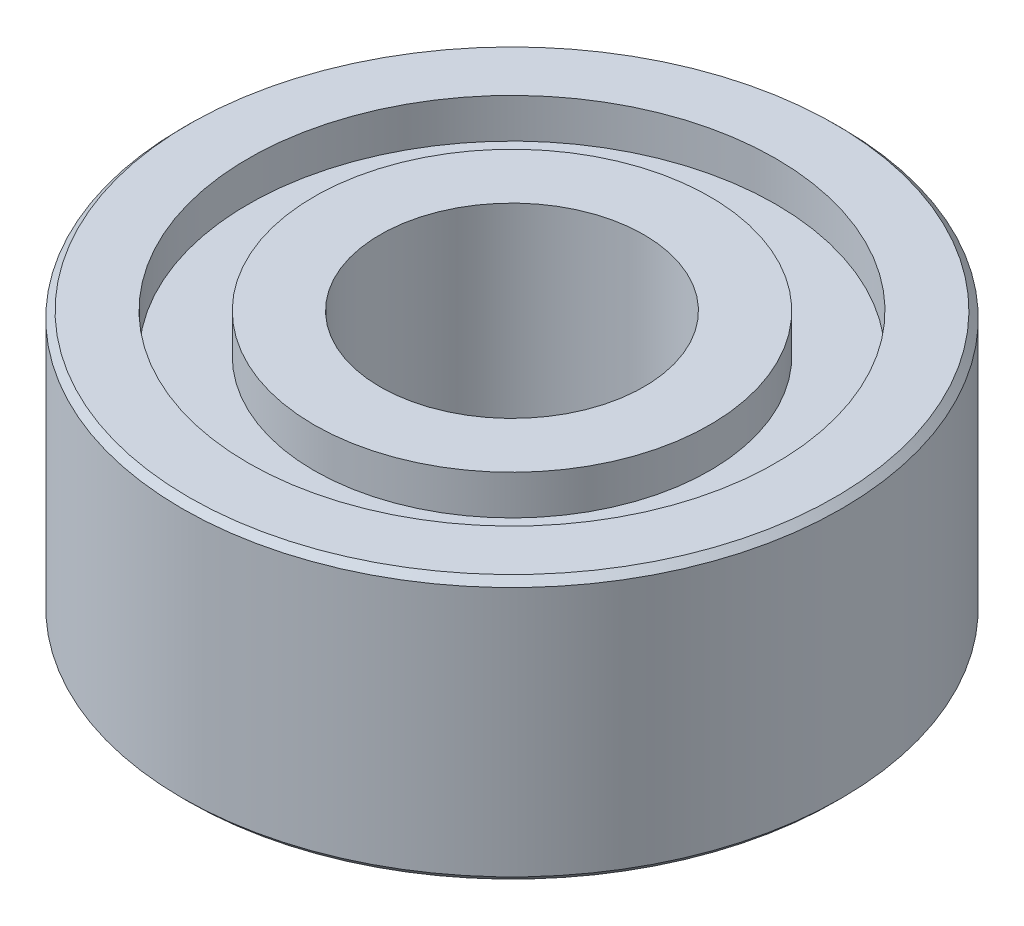
ISO-10303-21;
HEADER;
FILE_DESCRIPTION(('STEP AP214'),'2;1');
FILE_NAME('part.step','',(''),(''),'','','');
FILE_SCHEMA(('AUTOMOTIVE_DESIGN { 1 0 10303 214 1 1 1 1 }'));
ENDSEC;
DATA;
#1=APPLICATION_CONTEXT('core data for automotive mechanical design processes');
#2=APPLICATION_PROTOCOL_DEFINITION('international standard','automotive_design',2000,#1);
#3=PRODUCT_CONTEXT('',#1,'mechanical');
#4=PRODUCT('Part','Part','',(#3));
#5=PRODUCT_RELATED_PRODUCT_CATEGORY('part','',(#4));
#6=PRODUCT_DEFINITION_FORMATION('','',#4);
#7=PRODUCT_DEFINITION_CONTEXT('part definition',#1,'design');
#8=PRODUCT_DEFINITION('design','',#6,#7);
#9=PRODUCT_DEFINITION_SHAPE('','',#8);
#10=(LENGTH_UNIT() NAMED_UNIT(*) SI_UNIT(.MILLI.,.METRE.));
#11=(NAMED_UNIT(*) PLANE_ANGLE_UNIT() SI_UNIT($,.RADIAN.));
#12=(NAMED_UNIT(*) SI_UNIT($,.STERADIAN.) SOLID_ANGLE_UNIT());
#13=UNCERTAINTY_MEASURE_WITH_UNIT(LENGTH_MEASURE(1.E-05),#10,'distance_accuracy_value','');
#14=(GEOMETRIC_REPRESENTATION_CONTEXT(3) GLOBAL_UNCERTAINTY_ASSIGNED_CONTEXT((#13)) GLOBAL_UNIT_ASSIGNED_CONTEXT((#10,
#11,#12)) REPRESENTATION_CONTEXT('',''));
#15=CARTESIAN_POINT('',(0.,0.,0.));
#16=DIRECTION('',(0.,0.,1.));
#17=DIRECTION('',(1.,0.,0.));
#18=AXIS2_PLACEMENT_3D('',#15,#16,#17);
#19=CARTESIAN_POINT('',(0.,-2.,0.));
#20=DIRECTION('',(0.,1.,0.));
#21=DIRECTION('',(0.,0.,1.));
#22=AXIS2_PLACEMENT_3D('',#19,#20,#21);
#23=PLANE('',#22);
#24=CARTESIAN_POINT('',(0.,-2.,0.));
#25=DIRECTION('',(0.,1.,0.));
#26=DIRECTION('',(0.,0.,1.));
#27=AXIS2_PLACEMENT_3D('',#24,#25,#26);
#28=CIRCLE('',#27,2.);
#29=CARTESIAN_POINT('',(0.,-2.,2.));
#30=VERTEX_POINT('',#29);
#31=EDGE_CURVE('E54',#30,#30,#28,.T.);
#32=ORIENTED_EDGE('',*,*,#31,.T.);
#33=EDGE_LOOP('',(#32));
#34=FACE_BOUND('',#33,.T.);
#35=CARTESIAN_POINT('',(0.,-2.,0.));
#36=DIRECTION('',(0.,1.,0.));
#37=DIRECTION('',(0.,0.,1.));
#38=AXIS2_PLACEMENT_3D('',#35,#36,#37);
#39=CIRCLE('',#38,3.);
#40=CARTESIAN_POINT('',(0.,-2.,3.));
#41=VERTEX_POINT('',#40);
#42=EDGE_CURVE('E79',#41,#41,#39,.T.);
#43=ORIENTED_EDGE('',*,*,#42,.F.);
#44=EDGE_LOOP('',(#43));
#45=FACE_BOUND('',#44,.T.);
#46=ADVANCED_FACE('F33',(#34,#45),#23,.F.);
#47=CARTESIAN_POINT('',(0.,2.,0.));
#48=DIRECTION('',(0.,1.,0.));
#49=DIRECTION('',(0.,0.,1.));
#50=AXIS2_PLACEMENT_3D('',#47,#48,#49);
#51=PLANE('',#50);
#52=CARTESIAN_POINT('',(0.,2.,0.));
#53=DIRECTION('',(0.,1.,0.));
#54=DIRECTION('',(0.,0.,1.));
#55=AXIS2_PLACEMENT_3D('',#52,#53,#54);
#56=CIRCLE('',#55,2.);
#57=CARTESIAN_POINT('',(0.,2.,2.));
#58=VERTEX_POINT('',#57);
#59=EDGE_CURVE('E57',#58,#58,#56,.T.);
#60=ORIENTED_EDGE('',*,*,#59,.F.);
#61=EDGE_LOOP('',(#60));
#62=FACE_BOUND('',#61,.T.);
#63=CARTESIAN_POINT('',(0.,2.,0.));
#64=DIRECTION('',(0.,1.,0.));
#65=DIRECTION('',(0.,0.,1.));
#66=AXIS2_PLACEMENT_3D('',#63,#64,#65);
#67=CIRCLE('',#66,3.);
#68=CARTESIAN_POINT('',(0.,2.,3.));
#69=VERTEX_POINT('',#68);
#70=EDGE_CURVE('E67',#69,#69,#67,.T.);
#71=ORIENTED_EDGE('',*,*,#70,.T.);
#72=EDGE_LOOP('',(#71));
#73=FACE_BOUND('',#72,.T.);
#74=ADVANCED_FACE('F96',(#62,#73),#51,.T.);
#75=CARTESIAN_POINT('',(0.,-2.,0.));
#76=DIRECTION('',(0.,1.,0.));
#77=DIRECTION('',(0.,0.,1.));
#78=AXIS2_PLACEMENT_3D('',#75,#76,#77);
#79=CYLINDRICAL_SURFACE('',#78,5.);
#80=CARTESIAN_POINT('',(0.,-1.9,0.));
#81=DIRECTION('',(0.,1.,0.));
#82=DIRECTION('',(0.,0.,1.));
#83=AXIS2_PLACEMENT_3D('',#80,#81,#82);
#84=CIRCLE('',#83,5.);
#85=CARTESIAN_POINT('',(0.,-1.9,5.));
#86=VERTEX_POINT('',#85);
#87=EDGE_CURVE('E45',#86,#86,#84,.T.);
#88=ORIENTED_EDGE('',*,*,#87,.T.);
#89=EDGE_LOOP('',(#88));
#90=FACE_BOUND('',#89,.T.);
#91=CARTESIAN_POINT('',(0.,1.9,0.));
#92=DIRECTION('',(0.,1.,0.));
#93=DIRECTION('',(0.,0.,1.));
#94=AXIS2_PLACEMENT_3D('',#91,#92,#93);
#95=CIRCLE('',#94,5.);
#96=CARTESIAN_POINT('',(0.,1.9,5.));
#97=VERTEX_POINT('',#96);
#98=EDGE_CURVE('E49',#97,#97,#95,.F.);
#99=ORIENTED_EDGE('',*,*,#98,.T.);
#100=EDGE_LOOP('',(#99));
#101=FACE_BOUND('',#100,.T.);
#102=ADVANCED_FACE('F103',(#90,#101),#79,.T.);
#103=CARTESIAN_POINT('',(0.,-2.,0.));
#104=DIRECTION('',(0.,1.,0.));
#105=DIRECTION('',(0.,0.,1.));
#106=AXIS2_PLACEMENT_3D('',#103,#104,#105);
#107=CIRCLE('',#106,4.9);
#108=CARTESIAN_POINT('',(0.,-2.,4.9));
#109=VERTEX_POINT('',#108);
#110=EDGE_CURVE('E41',#109,#109,#107,.F.);
#111=ORIENTED_EDGE('',*,*,#110,.T.);
#112=EDGE_LOOP('',(#111));
#113=FACE_BOUND('',#112,.T.);
#114=CARTESIAN_POINT('',(0.,-2.,0.));
#115=DIRECTION('',(0.,1.,0.));
#116=DIRECTION('',(0.,0.,1.));
#117=AXIS2_PLACEMENT_3D('',#114,#115,#116);
#118=CIRCLE('',#117,4.);
#119=CARTESIAN_POINT('',(0.,-2.,4.));
#120=VERTEX_POINT('',#119);
#121=EDGE_CURVE('E73',#120,#120,#118,.T.);
#122=ORIENTED_EDGE('',*,*,#121,.T.);
#123=EDGE_LOOP('',(#122));
#124=FACE_BOUND('',#123,.T.);
#125=ADVANCED_FACE('F99',(#113,#124),#23,.F.);
#126=CARTESIAN_POINT('',(0.,-2.,0.));
#127=DIRECTION('',(0.,1.,0.));
#128=DIRECTION('',(0.,0.,1.));
#129=AXIS2_PLACEMENT_3D('',#126,#127,#128);
#130=CYLINDRICAL_SURFACE('',#129,2.);
#131=ORIENTED_EDGE('',*,*,#31,.F.);
#132=EDGE_LOOP('',(#131));
#133=FACE_BOUND('',#132,.T.);
#134=ORIENTED_EDGE('',*,*,#59,.T.);
#135=EDGE_LOOP('',(#134));
#136=FACE_BOUND('',#135,.T.);
#137=ADVANCED_FACE('F110',(#133,#136),#130,.F.);
#138=CARTESIAN_POINT('',(0.,2.,0.));
#139=DIRECTION('',(0.,1.,0.));
#140=DIRECTION('',(0.,0.,1.));
#141=AXIS2_PLACEMENT_3D('',#138,#139,#140);
#142=CIRCLE('',#141,4.9);
#143=CARTESIAN_POINT('',(0.,2.,4.9));
#144=VERTEX_POINT('',#143);
#145=EDGE_CURVE('E10',#144,#144,#142,.T.);
#146=ORIENTED_EDGE('',*,*,#145,.T.);
#147=EDGE_LOOP('',(#146));
#148=FACE_BOUND('',#147,.T.);
#149=CARTESIAN_POINT('',(0.,2.,0.));
#150=DIRECTION('',(0.,1.,0.));
#151=DIRECTION('',(0.,0.,1.));
#152=AXIS2_PLACEMENT_3D('',#149,#150,#151);
#153=CIRCLE('',#152,4.);
#154=CARTESIAN_POINT('',(0.,2.,4.));
#155=VERTEX_POINT('',#154);
#156=EDGE_CURVE('E61',#155,#155,#153,.T.);
#157=ORIENTED_EDGE('',*,*,#156,.F.);
#158=EDGE_LOOP('',(#157));
#159=FACE_BOUND('',#158,.T.);
#160=ADVANCED_FACE('F106',(#148,#159),#51,.T.);
#161=CARTESIAN_POINT('',(0.,1.4,0.));
#162=DIRECTION('',(0.,1.,0.));
#163=DIRECTION('',(0.,0.,1.));
#164=AXIS2_PLACEMENT_3D('',#161,#162,#163);
#165=CYLINDRICAL_SURFACE('',#164,4.);
#166=CARTESIAN_POINT('',(0.,1.4,0.));
#167=DIRECTION('',(0.,1.,0.));
#168=DIRECTION('',(0.,0.,1.));
#169=AXIS2_PLACEMENT_3D('',#166,#167,#168);
#170=CIRCLE('',#169,4.);
#171=CARTESIAN_POINT('',(0.,1.4,4.));
#172=VERTEX_POINT('',#171);
#173=EDGE_CURVE('E60',#172,#172,#170,.T.);
#174=ORIENTED_EDGE('',*,*,#173,.F.);
#175=EDGE_LOOP('',(#174));
#176=FACE_BOUND('',#175,.T.);
#177=ORIENTED_EDGE('',*,*,#156,.T.);
#178=EDGE_LOOP('',(#177));
#179=FACE_BOUND('',#178,.T.);
#180=ADVANCED_FACE('F137',(#176,#179),#165,.F.);
#181=CARTESIAN_POINT('',(0.,1.4,0.));
#182=DIRECTION('',(0.,1.,0.));
#183=DIRECTION('',(0.,0.,1.));
#184=AXIS2_PLACEMENT_3D('',#181,#182,#183);
#185=PLANE('',#184);
#186=CARTESIAN_POINT('',(0.,1.4,0.));
#187=DIRECTION('',(0.,1.,0.));
#188=DIRECTION('',(0.,0.,1.));
#189=AXIS2_PLACEMENT_3D('',#186,#187,#188);
#190=CIRCLE('',#189,3.);
#191=CARTESIAN_POINT('',(0.,1.4,3.));
#192=VERTEX_POINT('',#191);
#193=EDGE_CURVE('E64',#192,#192,#190,.T.);
#194=ORIENTED_EDGE('',*,*,#193,.F.);
#195=EDGE_LOOP('',(#194));
#196=FACE_BOUND('',#195,.T.);
#197=ORIENTED_EDGE('',*,*,#173,.T.);
#198=EDGE_LOOP('',(#197));
#199=FACE_BOUND('',#198,.T.);
#200=ADVANCED_FACE('F133',(#196,#199),#185,.T.);
#201=CARTESIAN_POINT('',(0.,1.4,0.));
#202=DIRECTION('',(0.,1.,0.));
#203=DIRECTION('',(0.,0.,1.));
#204=AXIS2_PLACEMENT_3D('',#201,#202,#203);
#205=CYLINDRICAL_SURFACE('',#204,3.);
#206=ORIENTED_EDGE('',*,*,#193,.T.);
#207=EDGE_LOOP('',(#206));
#208=FACE_BOUND('',#207,.T.);
#209=ORIENTED_EDGE('',*,*,#70,.F.);
#210=EDGE_LOOP('',(#209));
#211=FACE_BOUND('',#210,.T.);
#212=ADVANCED_FACE('F127',(#208,#211),#205,.T.);
#213=CARTESIAN_POINT('',(0.,-1.4,0.));
#214=DIRECTION('',(0.,-1.,0.));
#215=DIRECTION('',(0.,0.,1.));
#216=AXIS2_PLACEMENT_3D('',#213,#214,#215);
#217=PLANE('',#216);
#218=CARTESIAN_POINT('',(0.,-1.4,0.));
#219=DIRECTION('',(0.,1.,0.));
#220=DIRECTION('',(0.,0.,1.));
#221=AXIS2_PLACEMENT_3D('',#218,#219,#220);
#222=CIRCLE('',#221,4.);
#223=CARTESIAN_POINT('',(0.,-1.4,4.));
#224=VERTEX_POINT('',#223);
#225=EDGE_CURVE('E70',#224,#224,#222,.T.);
#226=ORIENTED_EDGE('',*,*,#225,.F.);
#227=EDGE_LOOP('',(#226));
#228=FACE_BOUND('',#227,.T.);
#229=CARTESIAN_POINT('',(0.,-1.4,0.));
#230=DIRECTION('',(0.,1.,0.));
#231=DIRECTION('',(0.,0.,1.));
#232=AXIS2_PLACEMENT_3D('',#229,#230,#231);
#233=CIRCLE('',#232,3.);
#234=CARTESIAN_POINT('',(0.,-1.4,3.));
#235=VERTEX_POINT('',#234);
#236=EDGE_CURVE('E76',#235,#235,#233,.T.);
#237=ORIENTED_EDGE('',*,*,#236,.T.);
#238=EDGE_LOOP('',(#237));
#239=FACE_BOUND('',#238,.T.);
#240=ADVANCED_FACE('F85',(#228,#239),#217,.T.);
#241=CARTESIAN_POINT('',(0.,-1.4,0.));
#242=DIRECTION('',(0.,-1.,0.));
#243=DIRECTION('',(0.,0.,-1.));
#244=AXIS2_PLACEMENT_3D('',#241,#242,#243);
#245=CYLINDRICAL_SURFACE('',#244,4.);
#246=ORIENTED_EDGE('',*,*,#225,.T.);
#247=EDGE_LOOP('',(#246));
#248=FACE_BOUND('',#247,.T.);
#249=ORIENTED_EDGE('',*,*,#121,.F.);
#250=EDGE_LOOP('',(#249));
#251=FACE_BOUND('',#250,.T.);
#252=ADVANCED_FACE('F91',(#248,#251),#245,.F.);
#253=CARTESIAN_POINT('',(0.,-1.4,0.));
#254=DIRECTION('',(0.,-1.,0.));
#255=DIRECTION('',(0.,0.,-1.));
#256=AXIS2_PLACEMENT_3D('',#253,#254,#255);
#257=CYLINDRICAL_SURFACE('',#256,3.);
#258=ORIENTED_EDGE('',*,*,#236,.F.);
#259=EDGE_LOOP('',(#258));
#260=FACE_BOUND('',#259,.T.);
#261=ORIENTED_EDGE('',*,*,#42,.T.);
#262=EDGE_LOOP('',(#261));
#263=FACE_BOUND('',#262,.T.);
#264=ADVANCED_FACE('F87',(#260,#263),#257,.T.);
#265=CARTESIAN_POINT('',(0.,-1.9,0.));
#266=DIRECTION('',(0.,1.,0.));
#267=DIRECTION('',(0.,0.,1.));
#268=AXIS2_PLACEMENT_3D('',#265,#266,#267);
#269=CONICAL_SURFACE('',#268,5.,0.785398163397453);
#270=ORIENTED_EDGE('',*,*,#110,.F.);
#271=EDGE_LOOP('',(#270));
#272=FACE_BOUND('',#271,.T.);
#273=ORIENTED_EDGE('',*,*,#87,.F.);
#274=EDGE_LOOP('',(#273));
#275=FACE_BOUND('',#274,.T.);
#276=ADVANCED_FACE('F90',(#272,#275),#269,.T.);
#277=CARTESIAN_POINT('',(0.,2.,0.));
#278=DIRECTION('',(0.,-1.,0.));
#279=DIRECTION('',(0.,0.,-1.));
#280=AXIS2_PLACEMENT_3D('',#277,#278,#279);
#281=CONICAL_SURFACE('',#280,4.9,0.785398163397457);
#282=ORIENTED_EDGE('',*,*,#98,.F.);
#283=EDGE_LOOP('',(#282));
#284=FACE_BOUND('',#283,.T.);
#285=ORIENTED_EDGE('',*,*,#145,.F.);
#286=EDGE_LOOP('',(#285));
#287=FACE_BOUND('',#286,.T.);
#288=ADVANCED_FACE('F36',(#284,#287),#281,.T.);
#289=CLOSED_SHELL('',(#46,#74,#102,#125,#137,#160,#180,#200,#212,#240,#252,#264,#276,#288));
#290=MANIFOLD_SOLID_BREP('B2',#289);
#291=ADVANCED_BREP_SHAPE_REPRESENTATION('',(#18,#290),#14);
#292=SHAPE_DEFINITION_REPRESENTATION(#9,#291);
ENDSEC;
END-ISO-10303-21;
